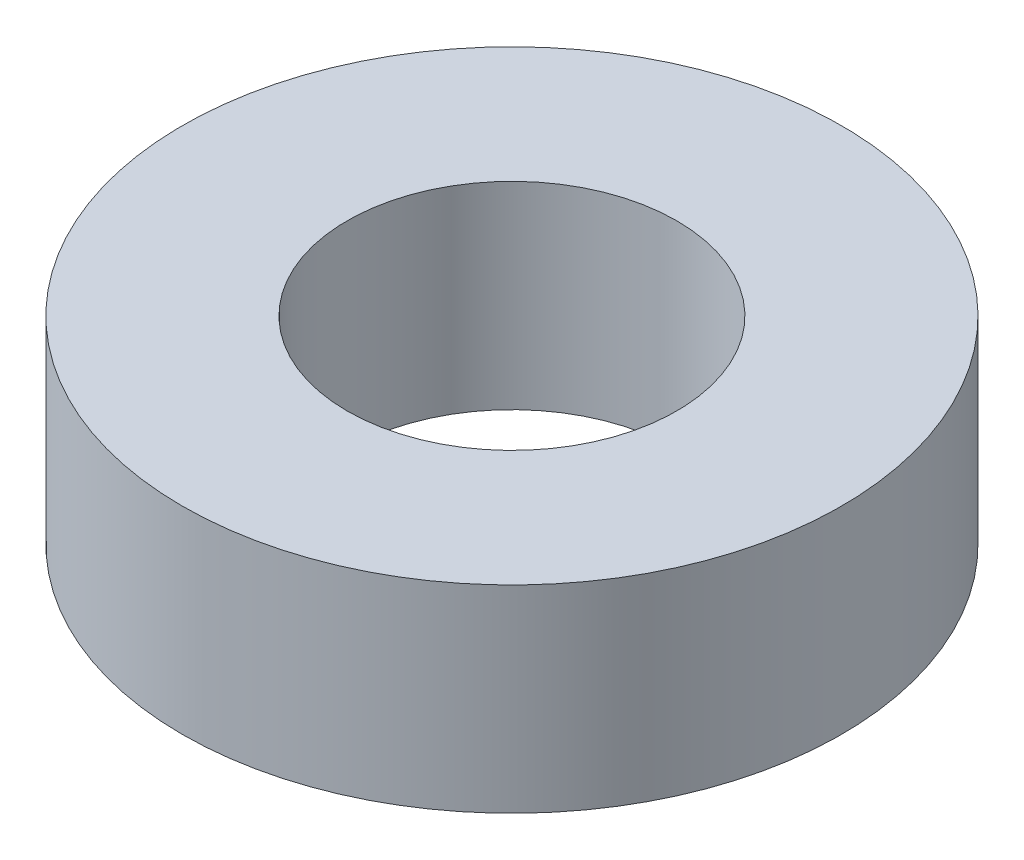
ISO-10303-21;
HEADER;
FILE_DESCRIPTION(('STEP AP214'),'2;1');
FILE_NAME('part.step','',(''),(''),'','','');
FILE_SCHEMA(('AUTOMOTIVE_DESIGN { 1 0 10303 214 1 1 1 1 }'));
ENDSEC;
DATA;
#1=APPLICATION_CONTEXT('core data for automotive mechanical design processes');
#2=APPLICATION_PROTOCOL_DEFINITION('international standard','automotive_design',2000,#1);
#3=PRODUCT_CONTEXT('',#1,'mechanical');
#4=PRODUCT('Part','Part','',(#3));
#5=PRODUCT_RELATED_PRODUCT_CATEGORY('part','',(#4));
#6=PRODUCT_DEFINITION_FORMATION('','',#4);
#7=PRODUCT_DEFINITION_CONTEXT('part definition',#1,'design');
#8=PRODUCT_DEFINITION('design','',#6,#7);
#9=PRODUCT_DEFINITION_SHAPE('','',#8);
#10=(LENGTH_UNIT() NAMED_UNIT(*) SI_UNIT(.MILLI.,.METRE.));
#11=(NAMED_UNIT(*) PLANE_ANGLE_UNIT() SI_UNIT($,.RADIAN.));
#12=(NAMED_UNIT(*) SI_UNIT($,.STERADIAN.) SOLID_ANGLE_UNIT());
#13=UNCERTAINTY_MEASURE_WITH_UNIT(LENGTH_MEASURE(1.E-05),#10,'distance_accuracy_value','');
#14=(GEOMETRIC_REPRESENTATION_CONTEXT(3) GLOBAL_UNCERTAINTY_ASSIGNED_CONTEXT((#13)) GLOBAL_UNIT_ASSIGNED_CONTEXT((#10,
#11,#12)) REPRESENTATION_CONTEXT('',''));
#15=CARTESIAN_POINT('',(0.,0.,0.));
#16=DIRECTION('',(0.,0.,1.));
#17=DIRECTION('',(1.,0.,0.));
#18=AXIS2_PLACEMENT_3D('',#15,#16,#17);
#19=CARTESIAN_POINT('',(0.,3.,0.));
#20=DIRECTION('',(0.,1.,0.));
#21=DIRECTION('',(0.,0.,1.));
#22=AXIS2_PLACEMENT_3D('',#19,#20,#21);
#23=PLANE('',#22);
#24=CARTESIAN_POINT('',(0.,3.,0.));
#25=DIRECTION('',(0.,1.,0.));
#26=DIRECTION('',(0.,0.,1.));
#27=AXIS2_PLACEMENT_3D('',#24,#25,#26);
#28=CIRCLE('',#27,5.);
#29=CARTESIAN_POINT('',(0.,3.,5.));
#30=VERTEX_POINT('',#29);
#31=EDGE_CURVE('E10',#30,#30,#28,.T.);
#32=ORIENTED_EDGE('',*,*,#31,.T.);
#33=EDGE_LOOP('',(#32));
#34=FACE_BOUND('',#33,.T.);
#35=CARTESIAN_POINT('',(0.,3.,0.));
#36=DIRECTION('',(0.,1.,0.));
#37=DIRECTION('',(0.,0.,1.));
#38=AXIS2_PLACEMENT_3D('',#35,#36,#37);
#39=CIRCLE('',#38,2.5);
#40=CARTESIAN_POINT('',(0.,3.,2.5));
#41=VERTEX_POINT('',#40);
#42=EDGE_CURVE('E42',#41,#41,#39,.T.);
#43=ORIENTED_EDGE('',*,*,#42,.F.);
#44=EDGE_LOOP('',(#43));
#45=FACE_BOUND('',#44,.T.);
#46=ADVANCED_FACE('F31',(#34,#45),#23,.T.);
#47=CARTESIAN_POINT('',(0.,0.,0.));
#48=DIRECTION('',(0.,1.,0.));
#49=DIRECTION('',(0.,0.,1.));
#50=AXIS2_PLACEMENT_3D('',#47,#48,#49);
#51=PLANE('',#50);
#52=CARTESIAN_POINT('',(0.,0.,0.));
#53=DIRECTION('',(0.,1.,0.));
#54=DIRECTION('',(0.,0.,1.));
#55=AXIS2_PLACEMENT_3D('',#52,#53,#54);
#56=CIRCLE('',#55,5.);
#57=CARTESIAN_POINT('',(0.,0.,5.));
#58=VERTEX_POINT('',#57);
#59=EDGE_CURVE('E35',#58,#58,#56,.T.);
#60=ORIENTED_EDGE('',*,*,#59,.F.);
#61=EDGE_LOOP('',(#60));
#62=FACE_BOUND('',#61,.T.);
#63=CARTESIAN_POINT('',(0.,0.,0.));
#64=DIRECTION('',(0.,1.,0.));
#65=DIRECTION('',(0.,0.,1.));
#66=AXIS2_PLACEMENT_3D('',#63,#64,#65);
#67=CIRCLE('',#66,2.5);
#68=CARTESIAN_POINT('',(0.,0.,2.5));
#69=VERTEX_POINT('',#68);
#70=EDGE_CURVE('E44',#69,#69,#67,.T.);
#71=ORIENTED_EDGE('',*,*,#70,.T.);
#72=EDGE_LOOP('',(#71));
#73=FACE_BOUND('',#72,.T.);
#74=ADVANCED_FACE('F54',(#62,#73),#51,.F.);
#75=CARTESIAN_POINT('',(0.,3.,0.));
#76=DIRECTION('',(0.,-1.,0.));
#77=DIRECTION('',(0.,0.,-1.));
#78=AXIS2_PLACEMENT_3D('',#75,#76,#77);
#79=CYLINDRICAL_SURFACE('',#78,5.);
#80=ORIENTED_EDGE('',*,*,#31,.F.);
#81=EDGE_LOOP('',(#80));
#82=FACE_BOUND('',#81,.T.);
#83=ORIENTED_EDGE('',*,*,#59,.T.);
#84=EDGE_LOOP('',(#83));
#85=FACE_BOUND('',#84,.T.);
#86=ADVANCED_FACE('F33',(#82,#85),#79,.T.);
#87=CARTESIAN_POINT('',(0.,3.,0.));
#88=DIRECTION('',(0.,-1.,0.));
#89=DIRECTION('',(0.,0.,-1.));
#90=AXIS2_PLACEMENT_3D('',#87,#88,#89);
#91=CYLINDRICAL_SURFACE('',#90,2.5);
#92=ORIENTED_EDGE('',*,*,#42,.T.);
#93=EDGE_LOOP('',(#92));
#94=FACE_BOUND('',#93,.T.);
#95=ORIENTED_EDGE('',*,*,#70,.F.);
#96=EDGE_LOOP('',(#95));
#97=FACE_BOUND('',#96,.T.);
#98=ADVANCED_FACE('F50',(#94,#97),#91,.F.);
#99=CLOSED_SHELL('',(#46,#74,#86,#98));
#100=MANIFOLD_SOLID_BREP('B2',#99);
#101=ADVANCED_BREP_SHAPE_REPRESENTATION('',(#18,#100),#14);
#102=SHAPE_DEFINITION_REPRESENTATION(#9,#101);
ENDSEC;
END-ISO-10303-21;
